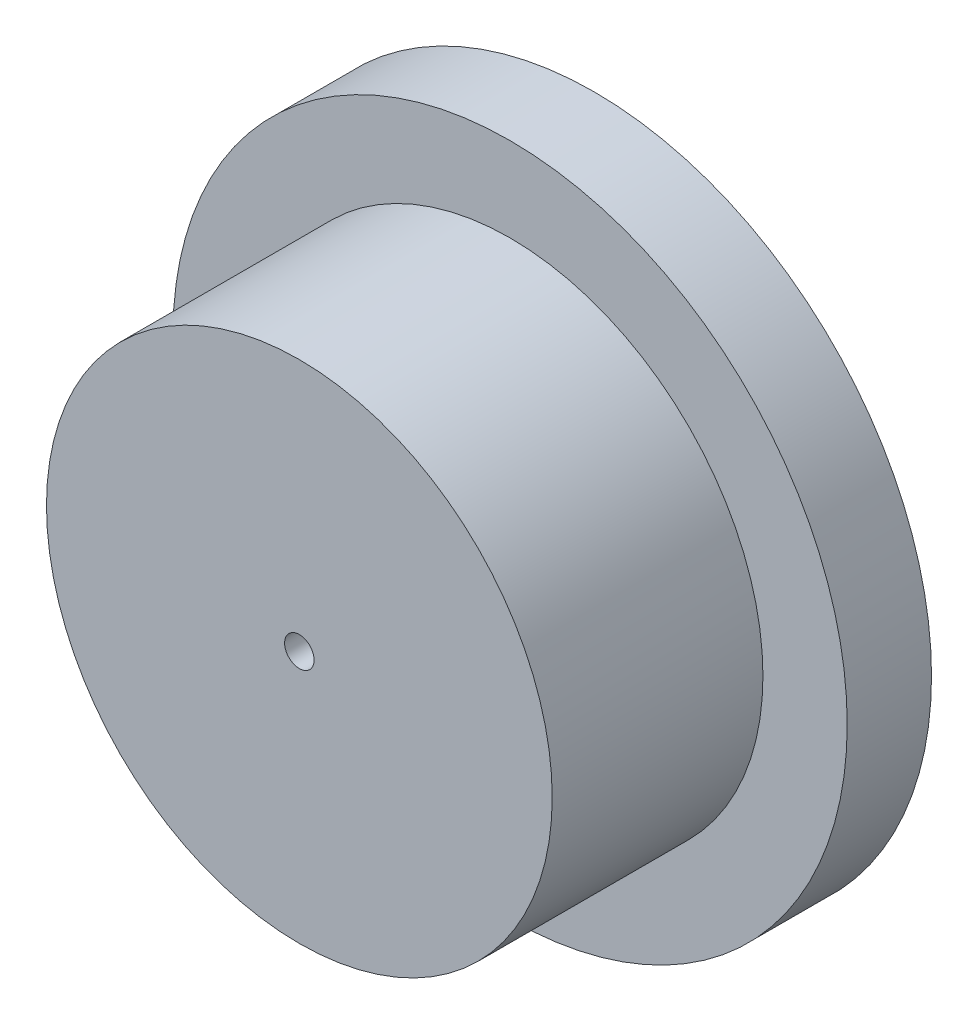
ISO-10303-21;
HEADER;
FILE_DESCRIPTION(('STEP AP214'),'2;1');
FILE_NAME('part.step','',(''),(''),'','','');
FILE_SCHEMA(('AUTOMOTIVE_DESIGN { 1 0 10303 214 1 1 1 1 }'));
ENDSEC;
DATA;
#1=APPLICATION_CONTEXT('core data for automotive mechanical design processes');
#2=APPLICATION_PROTOCOL_DEFINITION('international standard','automotive_design',2000,#1);
#3=PRODUCT_CONTEXT('',#1,'mechanical');
#4=PRODUCT('Part','Part','',(#3));
#5=PRODUCT_RELATED_PRODUCT_CATEGORY('part','',(#4));
#6=PRODUCT_DEFINITION_FORMATION('','',#4);
#7=PRODUCT_DEFINITION_CONTEXT('part definition',#1,'design');
#8=PRODUCT_DEFINITION('design','',#6,#7);
#9=PRODUCT_DEFINITION_SHAPE('','',#8);
#10=(LENGTH_UNIT() NAMED_UNIT(*) SI_UNIT(.MILLI.,.METRE.));
#11=(NAMED_UNIT(*) PLANE_ANGLE_UNIT() SI_UNIT($,.RADIAN.));
#12=(NAMED_UNIT(*) SI_UNIT($,.STERADIAN.) SOLID_ANGLE_UNIT());
#13=UNCERTAINTY_MEASURE_WITH_UNIT(LENGTH_MEASURE(1.E-05),#10,'distance_accuracy_value','');
#14=(GEOMETRIC_REPRESENTATION_CONTEXT(3) GLOBAL_UNCERTAINTY_ASSIGNED_CONTEXT((#13)) GLOBAL_UNIT_ASSIGNED_CONTEXT((#10,
#11,#12)) REPRESENTATION_CONTEXT('',''));
#15=CARTESIAN_POINT('',(0.,0.,0.));
#16=DIRECTION('',(0.,0.,1.));
#17=DIRECTION('',(1.,0.,0.));
#18=AXIS2_PLACEMENT_3D('',#15,#16,#17);
#19=CARTESIAN_POINT('',(0.,0.,2.));
#20=DIRECTION('',(0.,0.,1.));
#21=DIRECTION('',(1.,0.,0.));
#22=AXIS2_PLACEMENT_3D('',#19,#20,#21);
#23=PLANE('',#22);
#24=CARTESIAN_POINT('',(0.,0.,2.));
#25=DIRECTION('',(0.,0.,1.));
#26=DIRECTION('',(1.,0.,0.));
#27=AXIS2_PLACEMENT_3D('',#24,#25,#26);
#28=CIRCLE('',#27,8.);
#29=CARTESIAN_POINT('',(8.,0.,2.));
#30=VERTEX_POINT('',#29);
#31=EDGE_CURVE('E41',#30,#30,#28,.T.);
#32=ORIENTED_EDGE('',*,*,#31,.T.);
#33=EDGE_LOOP('',(#32));
#34=FACE_BOUND('',#33,.T.);
#35=CARTESIAN_POINT('',(0.,3.06206195639045E-13,2.));
#36=DIRECTION('',(0.,0.,1.));
#37=DIRECTION('',(1.,0.,0.));
#38=AXIS2_PLACEMENT_3D('',#35,#36,#37);
#39=CIRCLE('',#38,6.);
#40=CARTESIAN_POINT('',(6.,3.06206195639045E-13,2.));
#41=VERTEX_POINT('',#40);
#42=EDGE_CURVE('E51',#41,#41,#39,.T.);
#43=ORIENTED_EDGE('',*,*,#42,.F.);
#44=EDGE_LOOP('',(#43));
#45=FACE_BOUND('',#44,.T.);
#46=ADVANCED_FACE('F30',(#34,#45),#23,.T.);
#47=CARTESIAN_POINT('',(0.,0.,2.));
#48=DIRECTION('',(0.,0.,-1.));
#49=DIRECTION('',(-1.,0.,0.));
#50=AXIS2_PLACEMENT_3D('',#47,#48,#49);
#51=CYLINDRICAL_SURFACE('',#50,8.);
#52=ORIENTED_EDGE('',*,*,#31,.F.);
#53=EDGE_LOOP('',(#52));
#54=FACE_BOUND('',#53,.T.);
#55=CARTESIAN_POINT('',(0.,0.,0.));
#56=DIRECTION('',(0.,0.,1.));
#57=DIRECTION('',(1.,0.,0.));
#58=AXIS2_PLACEMENT_3D('',#55,#56,#57);
#59=CIRCLE('',#58,8.);
#60=CARTESIAN_POINT('',(8.,0.,0.));
#61=VERTEX_POINT('',#60);
#62=EDGE_CURVE('E45',#61,#61,#59,.T.);
#63=ORIENTED_EDGE('',*,*,#62,.T.);
#64=EDGE_LOOP('',(#63));
#65=FACE_BOUND('',#64,.T.);
#66=ADVANCED_FACE('F80',(#54,#65),#51,.T.);
#67=CARTESIAN_POINT('',(0.,0.,0.));
#68=DIRECTION('',(0.,0.,1.));
#69=DIRECTION('',(1.,0.,0.));
#70=AXIS2_PLACEMENT_3D('',#67,#68,#69);
#71=PLANE('',#70);
#72=CARTESIAN_POINT('',(0.,0.,0.));
#73=DIRECTION('',(0.,0.,-1.));
#74=DIRECTION('',(-1.,0.,0.));
#75=AXIS2_PLACEMENT_3D('',#72,#73,#74);
#76=CIRCLE('',#75,2.);
#77=CARTESIAN_POINT('',(-2.,0.,0.));
#78=VERTEX_POINT('',#77);
#79=EDGE_CURVE('E54',#78,#78,#76,.T.);
#80=ORIENTED_EDGE('',*,*,#79,.F.);
#81=EDGE_LOOP('',(#80));
#82=FACE_BOUND('',#81,.T.);
#83=ORIENTED_EDGE('',*,*,#62,.F.);
#84=EDGE_LOOP('',(#83));
#85=FACE_BOUND('',#84,.T.);
#86=ADVANCED_FACE('F75',(#82,#85),#71,.F.);
#87=CARTESIAN_POINT('',(0.,3.06206195639045E-13,7.));
#88=DIRECTION('',(0.,0.,-1.));
#89=DIRECTION('',(-1.,0.,0.));
#90=AXIS2_PLACEMENT_3D('',#87,#88,#89);
#91=CYLINDRICAL_SURFACE('',#90,6.);
#92=CARTESIAN_POINT('',(0.,3.06206195639045E-13,7.));
#93=DIRECTION('',(0.,0.,1.));
#94=DIRECTION('',(1.,0.,0.));
#95=AXIS2_PLACEMENT_3D('',#92,#93,#94);
#96=CIRCLE('',#95,6.);
#97=CARTESIAN_POINT('',(6.,3.06206195639045E-13,7.));
#98=VERTEX_POINT('',#97);
#99=EDGE_CURVE('E49',#98,#98,#96,.T.);
#100=ORIENTED_EDGE('',*,*,#99,.F.);
#101=EDGE_LOOP('',(#100));
#102=FACE_BOUND('',#101,.T.);
#103=ORIENTED_EDGE('',*,*,#42,.T.);
#104=EDGE_LOOP('',(#103));
#105=FACE_BOUND('',#104,.T.);
#106=ADVANCED_FACE('F69',(#102,#105),#91,.T.);
#107=CARTESIAN_POINT('',(0.,3.06206195639045E-13,7.));
#108=DIRECTION('',(0.,0.,1.));
#109=DIRECTION('',(1.,0.,0.));
#110=AXIS2_PLACEMENT_3D('',#107,#108,#109);
#111=PLANE('',#110);
#112=CARTESIAN_POINT('',(0.,0.,7.));
#113=DIRECTION('',(0.,0.,1.));
#114=DIRECTION('',(1.,0.,0.));
#115=AXIS2_PLACEMENT_3D('',#112,#113,#114);
#116=CIRCLE('',#115,0.35);
#117=CARTESIAN_POINT('',(0.35,0.,7.));
#118=VERTEX_POINT('',#117);
#119=EDGE_CURVE('E59',#118,#118,#116,.T.);
#120=ORIENTED_EDGE('',*,*,#119,.F.);
#121=EDGE_LOOP('',(#120));
#122=FACE_BOUND('',#121,.T.);
#123=ORIENTED_EDGE('',*,*,#99,.T.);
#124=EDGE_LOOP('',(#123));
#125=FACE_BOUND('',#124,.T.);
#126=ADVANCED_FACE('F65',(#122,#125),#111,.T.);
#127=CARTESIAN_POINT('',(0.,0.,2.));
#128=DIRECTION('',(0.,0.,-1.));
#129=DIRECTION('',(-1.,0.,0.));
#130=AXIS2_PLACEMENT_3D('',#127,#128,#129);
#131=CYLINDRICAL_SURFACE('',#130,2.);
#132=CARTESIAN_POINT('',(0.,0.,2.35000000000002));
#133=DIRECTION('',(0.,0.,-1.));
#134=DIRECTION('',(-1.,0.,0.));
#135=AXIS2_PLACEMENT_3D('',#132,#133,#134);
#136=CIRCLE('',#135,2.);
#137=CARTESIAN_POINT('',(-2.,0.,2.35000000000002));
#138=VERTEX_POINT('',#137);
#139=EDGE_CURVE('E10',#138,#138,#136,.F.);
#140=ORIENTED_EDGE('',*,*,#139,.T.);
#141=EDGE_LOOP('',(#140));
#142=FACE_BOUND('',#141,.T.);
#143=ORIENTED_EDGE('',*,*,#79,.T.);
#144=EDGE_LOOP('',(#143));
#145=FACE_BOUND('',#144,.T.);
#146=ADVANCED_FACE('F68',(#142,#145),#131,.F.);
#147=CARTESIAN_POINT('',(0.,0.,0.));
#148=DIRECTION('',(0.,0.,1.));
#149=DIRECTION('',(1.,0.,0.));
#150=AXIS2_PLACEMENT_3D('',#147,#148,#149);
#151=CYLINDRICAL_SURFACE('',#150,0.35);
#152=CARTESIAN_POINT('',(0.,0.,4.00000000000003));
#153=DIRECTION('',(0.,0.,-1.));
#154=DIRECTION('',(-1.,0.,0.));
#155=AXIS2_PLACEMENT_3D('',#152,#153,#154);
#156=CIRCLE('',#155,0.35);
#157=CARTESIAN_POINT('',(-0.35,0.,4.00000000000004));
#158=VERTEX_POINT('',#157);
#159=EDGE_CURVE('E37',#158,#158,#156,.T.);
#160=ORIENTED_EDGE('',*,*,#159,.T.);
#161=EDGE_LOOP('',(#160));
#162=FACE_BOUND('',#161,.T.);
#163=ORIENTED_EDGE('',*,*,#119,.T.);
#164=EDGE_LOOP('',(#163));
#165=FACE_BOUND('',#164,.T.);
#166=ADVANCED_FACE('F63',(#162,#165),#151,.F.);
#167=CARTESIAN_POINT('',(0.,0.,4.00000000000003));
#168=DIRECTION('',(0.,0.,-1.));
#169=DIRECTION('',(-1.,0.,0.));
#170=AXIS2_PLACEMENT_3D('',#167,#168,#169);
#171=CONICAL_SURFACE('',#170,0.35,0.785398163397443);
#172=CARTESIAN_POINT('',(-2.,0.,2.35000000000002));
#173=CARTESIAN_POINT('',(-1.9828125,0.,2.36718750000002));
#174=CARTESIAN_POINT('',(-1.965625,0.,2.38437500000002));
#175=CARTESIAN_POINT('',(-1.93125,0.,2.41875000000002));
#176=CARTESIAN_POINT('',(-1.9140625,0.,2.43593750000002));
#177=CARTESIAN_POINT('',(-1.8796875,0.,2.47031250000002));
#178=CARTESIAN_POINT('',(-1.8625,0.,2.48750000000002));
#179=CARTESIAN_POINT('',(-1.828125,0.,2.52187500000002));
#180=CARTESIAN_POINT('',(-1.8109375,0.,2.53906250000002));
#181=CARTESIAN_POINT('',(-1.7765625,0.,2.57343750000002));
#182=CARTESIAN_POINT('',(-1.759375,0.,2.59062500000002));
#183=CARTESIAN_POINT('',(-1.725,0.,2.62500000000002));
#184=CARTESIAN_POINT('',(-1.7078125,0.,2.64218750000002));
#185=CARTESIAN_POINT('',(-1.6734375,0.,2.67656250000002));
#186=CARTESIAN_POINT('',(-1.65625,0.,2.69375000000002));
#187=CARTESIAN_POINT('',(-1.621875,0.,2.72812500000002));
#188=CARTESIAN_POINT('',(-1.6046875,0.,2.74531250000002));
#189=CARTESIAN_POINT('',(-1.5703125,0.,2.77968750000002));
#190=CARTESIAN_POINT('',(-1.553125,0.,2.79687500000002));
#191=CARTESIAN_POINT('',(-1.51875,0.,2.83125000000002));
#192=CARTESIAN_POINT('',(-1.5015625,0.,2.84843750000002));
#193=CARTESIAN_POINT('',(-1.4671875,0.,2.88281250000002));
#194=CARTESIAN_POINT('',(-1.45,0.,2.90000000000002));
#195=CARTESIAN_POINT('',(-1.415625,0.,2.93437500000002));
#196=CARTESIAN_POINT('',(-1.3984375,0.,2.95156250000002));
#197=CARTESIAN_POINT('',(-1.3640625,0.,2.98593750000003));
#198=CARTESIAN_POINT('',(-1.346875,0.,3.00312500000002));
#199=CARTESIAN_POINT('',(-1.3125,0.,3.03750000000003));
#200=CARTESIAN_POINT('',(-1.2953125,0.,3.05468750000003));
#201=CARTESIAN_POINT('',(-1.2609375,0.,3.08906250000003));
#202=CARTESIAN_POINT('',(-1.24375,0.,3.10625000000003));
#203=CARTESIAN_POINT('',(-1.209375,0.,3.14062500000003));
#204=CARTESIAN_POINT('',(-1.1921875,0.,3.15781250000003));
#205=CARTESIAN_POINT('',(-1.1578125,0.,3.19218750000003));
#206=CARTESIAN_POINT('',(-1.140625,0.,3.20937500000003));
#207=CARTESIAN_POINT('',(-1.10625,0.,3.24375000000003));
#208=CARTESIAN_POINT('',(-1.0890625,0.,3.26093750000003));
#209=CARTESIAN_POINT('',(-1.0546875,0.,3.29531250000003));
#210=CARTESIAN_POINT('',(-1.0375,0.,3.31250000000003));
#211=CARTESIAN_POINT('',(-1.003125,0.,3.34687500000003));
#212=CARTESIAN_POINT('',(-0.9859375,0.,3.36406250000003));
#213=CARTESIAN_POINT('',(-0.9515625,0.,3.39843750000003));
#214=CARTESIAN_POINT('',(-0.934375,0.,3.41562500000003));
#215=CARTESIAN_POINT('',(-0.9,0.,3.45000000000003));
#216=CARTESIAN_POINT('',(-0.882812499999999,0.,3.46718750000003));
#217=CARTESIAN_POINT('',(-0.8484375,0.,3.50156250000003));
#218=CARTESIAN_POINT('',(-0.83125,0.,3.51875000000003));
#219=CARTESIAN_POINT('',(-0.796875,0.,3.55312500000003));
#220=CARTESIAN_POINT('',(-0.7796875,0.,3.57031250000003));
#221=CARTESIAN_POINT('',(-0.745312499999999,0.,3.60468750000003));
#222=CARTESIAN_POINT('',(-0.728125,0.,3.62187500000003));
#223=CARTESIAN_POINT('',(-0.69375,0.,3.65625000000003));
#224=CARTESIAN_POINT('',(-0.6765625,0.,3.67343750000003));
#225=CARTESIAN_POINT('',(-0.6421875,0.,3.70781250000003));
#226=CARTESIAN_POINT('',(-0.625,0.,3.72500000000003));
#227=CARTESIAN_POINT('',(-0.590625,0.,3.75937500000003));
#228=CARTESIAN_POINT('',(-0.573437499999999,0.,3.77656250000003));
#229=CARTESIAN_POINT('',(-0.5390625,0.,3.81093750000003));
#230=CARTESIAN_POINT('',(-0.521875,0.,3.82812500000003));
#231=CARTESIAN_POINT('',(-0.4875,0.,3.86250000000003));
#232=CARTESIAN_POINT('',(-0.4703125,0.,3.87968750000003));
#233=CARTESIAN_POINT('',(-0.4359375,0.,3.91406250000003));
#234=CARTESIAN_POINT('',(-0.41875,0.,3.93125000000003));
#235=CARTESIAN_POINT('',(-0.384375,0.,3.96562500000003));
#236=CARTESIAN_POINT('',(-0.3671875,0.,3.98281250000003));
#237=CARTESIAN_POINT('',(-0.35,0.,4.00000000000003));
#238=B_SPLINE_CURVE_WITH_KNOTS('',3,(#172,#173,#174,#175,#176,#177,#178,#179,#180,#181,#182,
#183,#184,#185,#186,#187,#188,#189,#190,#191,#192,#193,#194,#195,#196,#197,#198,#199,#200,#201,
#202,#203,#204,#205,#206,#207,#208,#209,#210,#211,#212,#213,#214,#215,#216,#217,#218,#219,#220,
#221,#222,#223,#224,#225,#226,#227,#228,#229,#230,#231,#232,#233,#234,#235,#236,#237),
.UNSPECIFIED.,.F.,.F.,(4,2,2,2,2,2,2,2,2,2,2,2,2,2,2,2,2,2,2,2,2,2,2,2,2,2,2,2,2,2,2,2,4),(0.,
0.0729203868098633,0.145840773619726,0.218761160429589,0.291681547239452,0.364601934049315,
0.437522320859179,0.510442707669041,0.583363094478905,0.656283481288768,0.729203868098631,
0.802124254908494,0.875044641718357,0.94796502852822,1.02088541533808,1.09380580214795,
1.16672618895781,1.23964657576767,1.31256696257754,1.3854873493874,1.45840773619726,
1.53132812300712,1.60424850981699,1.67716889662685,1.75008928343671,1.82300967024658,
1.89593005705644,1.9688504438663,2.04177083067617,2.11469121748603,2.18761160429589,
2.26053199110576,2.33345237791562),.UNSPECIFIED.);
#239=EDGE_CURVE('BSEAM32',#138,#158,#238,.T.);
#240=ORIENTED_EDGE('',*,*,#139,.F.);
#241=ORIENTED_EDGE('',*,*,#159,.F.);
#242=ORIENTED_EDGE('',*,*,#239,.T.);
#243=ORIENTED_EDGE('',*,*,#239,.F.);
#244=EDGE_LOOP('',(#240,#242,#241,#243));
#245=FACE_BOUND('',#244,.T.);
#246=ADVANCED_FACE('F32',(#245),#171,.F.);
#247=CLOSED_SHELL('',(#46,#66,#86,#106,#126,#146,#166,#246));
#248=MANIFOLD_SOLID_BREP('B2',#247);
#249=ADVANCED_BREP_SHAPE_REPRESENTATION('',(#18,#248),#14);
#250=SHAPE_DEFINITION_REPRESENTATION(#9,#249);
ENDSEC;
END-ISO-10303-21;
